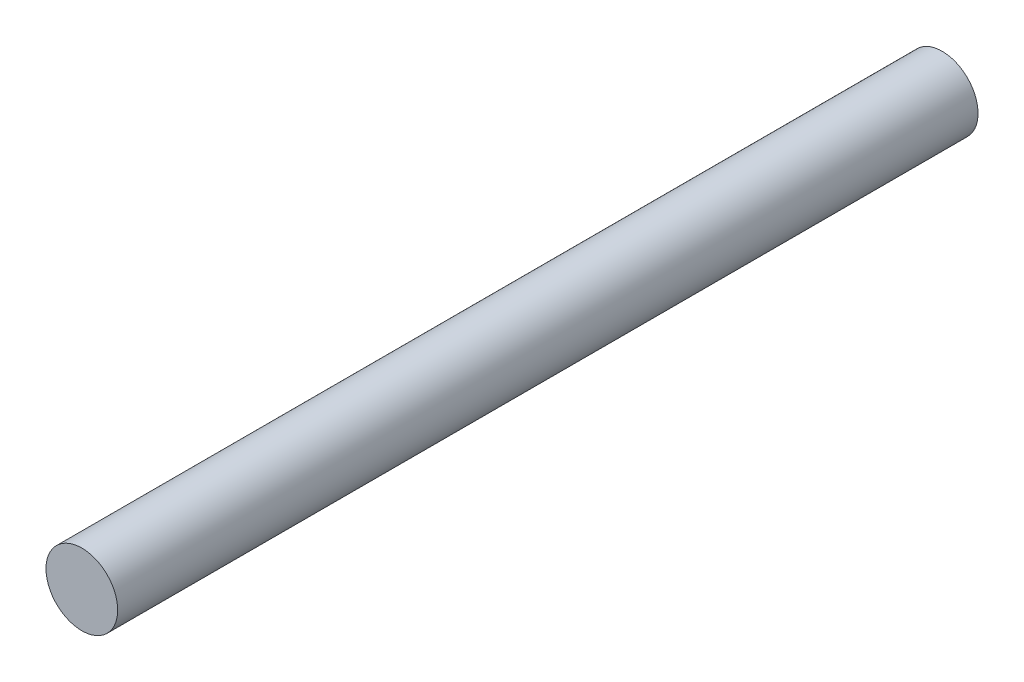
ISO-10303-21;
HEADER;
FILE_DESCRIPTION(('STEP AP214'),'2;1');
FILE_NAME('part.step','',(''),(''),'','','');
FILE_SCHEMA(('AUTOMOTIVE_DESIGN { 1 0 10303 214 1 1 1 1 }'));
ENDSEC;
DATA;
#1=APPLICATION_CONTEXT('core data for automotive mechanical design processes');
#2=APPLICATION_PROTOCOL_DEFINITION('international standard','automotive_design',2000,#1);
#3=PRODUCT_CONTEXT('',#1,'mechanical');
#4=PRODUCT('Part','Part','',(#3));
#5=PRODUCT_RELATED_PRODUCT_CATEGORY('part','',(#4));
#6=PRODUCT_DEFINITION_FORMATION('','',#4);
#7=PRODUCT_DEFINITION_CONTEXT('part definition',#1,'design');
#8=PRODUCT_DEFINITION('design','',#6,#7);
#9=PRODUCT_DEFINITION_SHAPE('','',#8);
#10=(LENGTH_UNIT() NAMED_UNIT(*) SI_UNIT(.MILLI.,.METRE.));
#11=(NAMED_UNIT(*) PLANE_ANGLE_UNIT() SI_UNIT($,.RADIAN.));
#12=(NAMED_UNIT(*) SI_UNIT($,.STERADIAN.) SOLID_ANGLE_UNIT());
#13=UNCERTAINTY_MEASURE_WITH_UNIT(LENGTH_MEASURE(1.E-05),#10,'distance_accuracy_value','');
#14=(GEOMETRIC_REPRESENTATION_CONTEXT(3) GLOBAL_UNCERTAINTY_ASSIGNED_CONTEXT((#13)) GLOBAL_UNIT_ASSIGNED_CONTEXT((#10,
#11,#12)) REPRESENTATION_CONTEXT('',''));
#15=CARTESIAN_POINT('',(0.,0.,0.));
#16=DIRECTION('',(0.,0.,1.));
#17=DIRECTION('',(1.,0.,0.));
#18=AXIS2_PLACEMENT_3D('',#15,#16,#17);
#19=CARTESIAN_POINT('',(0.,0.,76.2));
#20=DIRECTION('',(0.,0.,-1.));
#21=DIRECTION('',(-1.,0.,0.));
#22=AXIS2_PLACEMENT_3D('',#19,#20,#21);
#23=CYLINDRICAL_SURFACE('',#22,3.175);
#24=CARTESIAN_POINT('',(0.,0.,76.2));
#25=DIRECTION('',(0.,0.,1.));
#26=DIRECTION('',(1.,0.,0.));
#27=AXIS2_PLACEMENT_3D('',#24,#25,#26);
#28=CIRCLE('',#27,3.175);
#29=CARTESIAN_POINT('',(-3.175,0.,76.2));
#30=VERTEX_POINT('',#29);
#31=EDGE_CURVE('E10',#30,#30,#28,.T.);
#32=CARTESIAN_POINT('',(0.,0.,0.));
#33=DIRECTION('',(0.,0.,1.));
#34=DIRECTION('',(1.,0.,0.));
#35=AXIS2_PLACEMENT_3D('',#32,#33,#34);
#36=CIRCLE('',#35,3.175);
#37=CARTESIAN_POINT('',(-3.175,0.,0.));
#38=VERTEX_POINT('',#37);
#39=EDGE_CURVE('E37',#38,#38,#36,.T.);
#40=CARTESIAN_POINT('',(-3.175,0.,76.2));
#41=CARTESIAN_POINT('',(-3.175,0.,75.40625));
#42=CARTESIAN_POINT('',(-3.175,0.,74.6125));
#43=CARTESIAN_POINT('',(-3.175,0.,73.025));
#44=CARTESIAN_POINT('',(-3.175,0.,72.23125));
#45=CARTESIAN_POINT('',(-3.175,0.,70.64375));
#46=CARTESIAN_POINT('',(-3.175,0.,69.85));
#47=CARTESIAN_POINT('',(-3.175,0.,68.2625));
#48=CARTESIAN_POINT('',(-3.175,0.,67.46875));
#49=CARTESIAN_POINT('',(-3.175,0.,65.88125));
#50=CARTESIAN_POINT('',(-3.175,0.,65.0875));
#51=CARTESIAN_POINT('',(-3.175,0.,63.5));
#52=CARTESIAN_POINT('',(-3.175,0.,62.70625));
#53=CARTESIAN_POINT('',(-3.175,0.,61.11875));
#54=CARTESIAN_POINT('',(-3.175,0.,60.325));
#55=CARTESIAN_POINT('',(-3.175,0.,58.7375));
#56=CARTESIAN_POINT('',(-3.175,0.,57.94375));
#57=CARTESIAN_POINT('',(-3.175,0.,56.35625));
#58=CARTESIAN_POINT('',(-3.175,0.,55.5625));
#59=CARTESIAN_POINT('',(-3.175,0.,53.975));
#60=CARTESIAN_POINT('',(-3.175,0.,53.18125));
#61=CARTESIAN_POINT('',(-3.175,0.,51.59375));
#62=CARTESIAN_POINT('',(-3.175,0.,50.8));
#63=CARTESIAN_POINT('',(-3.175,0.,49.2125));
#64=CARTESIAN_POINT('',(-3.175,0.,48.41875));
#65=CARTESIAN_POINT('',(-3.175,0.,46.83125));
#66=CARTESIAN_POINT('',(-3.175,0.,46.0375));
#67=CARTESIAN_POINT('',(-3.175,0.,44.45));
#68=CARTESIAN_POINT('',(-3.175,0.,43.65625));
#69=CARTESIAN_POINT('',(-3.175,0.,42.06875));
#70=CARTESIAN_POINT('',(-3.175,0.,41.275));
#71=CARTESIAN_POINT('',(-3.175,0.,39.6875));
#72=CARTESIAN_POINT('',(-3.175,0.,38.89375));
#73=CARTESIAN_POINT('',(-3.175,0.,37.30625));
#74=CARTESIAN_POINT('',(-3.175,0.,36.5125));
#75=CARTESIAN_POINT('',(-3.175,0.,34.925));
#76=CARTESIAN_POINT('',(-3.175,0.,34.13125));
#77=CARTESIAN_POINT('',(-3.175,0.,32.54375));
#78=CARTESIAN_POINT('',(-3.175,0.,31.75));
#79=CARTESIAN_POINT('',(-3.175,0.,30.1625));
#80=CARTESIAN_POINT('',(-3.175,0.,29.36875));
#81=CARTESIAN_POINT('',(-3.175,0.,27.78125));
#82=CARTESIAN_POINT('',(-3.175,0.,26.9875));
#83=CARTESIAN_POINT('',(-3.175,0.,25.4));
#84=CARTESIAN_POINT('',(-3.175,0.,24.60625));
#85=CARTESIAN_POINT('',(-3.175,0.,23.01875));
#86=CARTESIAN_POINT('',(-3.175,0.,22.225));
#87=CARTESIAN_POINT('',(-3.175,0.,20.6375));
#88=CARTESIAN_POINT('',(-3.175,0.,19.84375));
#89=CARTESIAN_POINT('',(-3.175,0.,18.25625));
#90=CARTESIAN_POINT('',(-3.175,0.,17.4625));
#91=CARTESIAN_POINT('',(-3.175,0.,15.875));
#92=CARTESIAN_POINT('',(-3.175,0.,15.08125));
#93=CARTESIAN_POINT('',(-3.175,0.,13.49375));
#94=CARTESIAN_POINT('',(-3.175,0.,12.7));
#95=CARTESIAN_POINT('',(-3.175,0.,11.1125));
#96=CARTESIAN_POINT('',(-3.175,0.,10.31875));
#97=CARTESIAN_POINT('',(-3.175,0.,8.73125));
#98=CARTESIAN_POINT('',(-3.175,0.,7.93750000000001));
#99=CARTESIAN_POINT('',(-3.175,0.,6.35));
#100=CARTESIAN_POINT('',(-3.175,0.,5.55625));
#101=CARTESIAN_POINT('',(-3.175,0.,3.96875));
#102=CARTESIAN_POINT('',(-3.175,0.,3.175));
#103=CARTESIAN_POINT('',(-3.175,0.,1.5875));
#104=CARTESIAN_POINT('',(-3.175,0.,0.793750000000001));
#105=CARTESIAN_POINT('',(-3.175,0.,0.));
#106=B_SPLINE_CURVE_WITH_KNOTS('',3,(#40,#41,#42,#43,#44,#45,#46,#47,#48,#49,#50,#51,#52,#53,
#54,#55,#56,#57,#58,#59,#60,#61,#62,#63,#64,#65,#66,#67,#68,#69,#70,#71,#72,#73,#74,#75,#76,#77,
#78,#79,#80,#81,#82,#83,#84,#85,#86,#87,#88,#89,#90,#91,#92,#93,#94,#95,#96,#97,#98,#99,#100,
#101,#102,#103,#104,#105),.UNSPECIFIED.,.F.,.F.,(4,2,2,2,2,2,2,2,2,2,2,2,2,2,2,2,2,2,2,2,2,2,2,
2,2,2,2,2,2,2,2,2,4),(0.,2.38125,4.7625,7.14375,9.52500000000001,11.90625,14.2875,16.66875,
19.05,21.43125,23.8125,26.19375,28.575,30.95625,33.3375,35.71875,38.1,40.48125,42.8625,45.24375,
47.625,50.00625,52.3875,54.76875,57.15,59.53125,61.9125,64.29375,66.675,69.05625,71.4375,
73.81875,76.2),.UNSPECIFIED.);
#107=EDGE_CURVE('BSEAM34',#30,#38,#106,.T.);
#108=ORIENTED_EDGE('',*,*,#31,.F.);
#109=ORIENTED_EDGE('',*,*,#39,.T.);
#110=ORIENTED_EDGE('',*,*,#107,.T.);
#111=ORIENTED_EDGE('',*,*,#107,.F.);
#112=EDGE_LOOP('',(#108,#110,#109,#111));
#113=FACE_BOUND('',#112,.T.);
#114=ADVANCED_FACE('F34',(#113),#23,.T.);
#115=CARTESIAN_POINT('',(0.,0.,76.2));
#116=DIRECTION('',(0.,0.,1.));
#117=DIRECTION('',(1.,0.,0.));
#118=AXIS2_PLACEMENT_3D('',#115,#116,#117);
#119=PLANE('',#118);
#120=ORIENTED_EDGE('',*,*,#31,.T.);
#121=EDGE_LOOP('',(#120));
#122=FACE_BOUND('',#121,.T.);
#123=ADVANCED_FACE('F51',(#122),#119,.T.);
#124=CARTESIAN_POINT('',(0.,0.,0.));
#125=DIRECTION('',(0.,0.,1.));
#126=DIRECTION('',(1.,0.,0.));
#127=AXIS2_PLACEMENT_3D('',#124,#125,#126);
#128=PLANE('',#127);
#129=ORIENTED_EDGE('',*,*,#39,.F.);
#130=EDGE_LOOP('',(#129));
#131=FACE_BOUND('',#130,.T.);
#132=ADVANCED_FACE('F49',(#131),#128,.F.);
#133=CLOSED_SHELL('',(#114,#123,#132));
#134=MANIFOLD_SOLID_BREP('B2',#133);
#135=ADVANCED_BREP_SHAPE_REPRESENTATION('',(#18,#134),#14);
#136=SHAPE_DEFINITION_REPRESENTATION(#9,#135);
ENDSEC;
END-ISO-10303-21;
